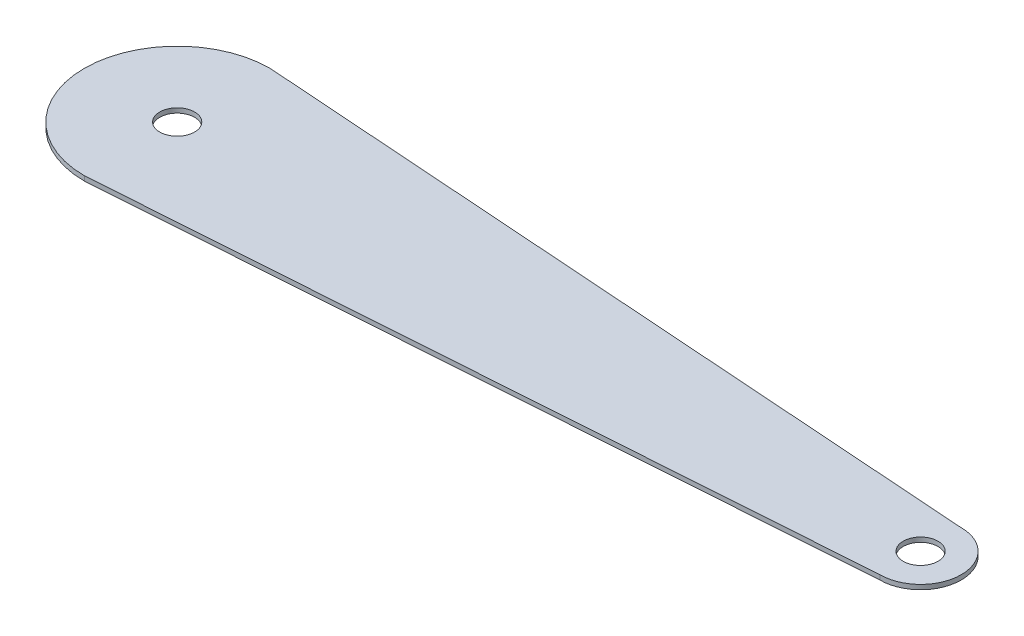
ISO-10303-21;
HEADER;
FILE_DESCRIPTION(('STEP AP214'),'2;1');
FILE_NAME('part.step','',(''),(''),'','','');
FILE_SCHEMA(('AUTOMOTIVE_DESIGN { 1 0 10303 214 1 1 1 1 }'));
ENDSEC;
DATA;
#1=APPLICATION_CONTEXT('core data for automotive mechanical design processes');
#2=APPLICATION_PROTOCOL_DEFINITION('international standard','automotive_design',2000,#1);
#3=PRODUCT_CONTEXT('',#1,'mechanical');
#4=PRODUCT('Part','Part','',(#3));
#5=PRODUCT_RELATED_PRODUCT_CATEGORY('part','',(#4));
#6=PRODUCT_DEFINITION_FORMATION('','',#4);
#7=PRODUCT_DEFINITION_CONTEXT('part definition',#1,'design');
#8=PRODUCT_DEFINITION('design','',#6,#7);
#9=PRODUCT_DEFINITION_SHAPE('','',#8);
#10=(LENGTH_UNIT() NAMED_UNIT(*) SI_UNIT(.MILLI.,.METRE.));
#11=(NAMED_UNIT(*) PLANE_ANGLE_UNIT() SI_UNIT($,.RADIAN.));
#12=(NAMED_UNIT(*) SI_UNIT($,.STERADIAN.) SOLID_ANGLE_UNIT());
#13=UNCERTAINTY_MEASURE_WITH_UNIT(LENGTH_MEASURE(1.E-05),#10,'distance_accuracy_value','');
#14=(GEOMETRIC_REPRESENTATION_CONTEXT(3) GLOBAL_UNCERTAINTY_ASSIGNED_CONTEXT((#13)) GLOBAL_UNIT_ASSIGNED_CONTEXT((#10,
#11,#12)) REPRESENTATION_CONTEXT('',''));
#15=CARTESIAN_POINT('',(0.,0.,0.));
#16=DIRECTION('',(0.,0.,1.));
#17=DIRECTION('',(1.,0.,0.));
#18=AXIS2_PLACEMENT_3D('',#15,#16,#17);
#19=CARTESIAN_POINT('',(2.55465532948679,2.54,36.3328757971454));
#20=DIRECTION('',(0.0701393346692204,0.,0.997537204184465));
#21=DIRECTION('',(0.997537204184465,0.,-0.0701393346692204));
#22=AXIS2_PLACEMENT_3D('',#19,#20,#21);
#23=PLANE('',#22);
#24=DIRECTION('',(-0.997537204184465,0.,0.0701393346692204));
#25=VECTOR('',#24,1.);
#26=CARTESIAN_POINT('',(2.55465532948679,0.,36.3328757971454));
#27=LINE('',#26,#25);
#28=CARTESIAN_POINT('',(203.2,0.,22.2249999999999));
#29=VERTEX_POINT('',#28);
#30=CARTESIAN_POINT('',(-203.2,0.,50.8));
#31=VERTEX_POINT('',#30);
#32=EDGE_CURVE('E107',#29,#31,#27,.T.);
#33=ORIENTED_EDGE('',*,*,#32,.F.);
#34=DIRECTION('',(0.,-1.,0.));
#35=VECTOR('',#34,1.);
#36=CARTESIAN_POINT('',(203.2,2.54,22.2249999999999));
#37=LINE('',#36,#35);
#38=CARTESIAN_POINT('',(203.2,2.54,22.2249999999999));
#39=VERTEX_POINT('',#38);
#40=EDGE_CURVE('E11',#39,#29,#37,.T.);
#41=ORIENTED_EDGE('',*,*,#40,.F.);
#42=DIRECTION('',(-0.997537204184465,0.,0.0701393346692204));
#43=VECTOR('',#42,1.);
#44=CARTESIAN_POINT('',(2.55465532948679,2.54,36.3328757971454));
#45=LINE('',#44,#43);
#46=CARTESIAN_POINT('',(-203.2,2.54,50.8));
#47=VERTEX_POINT('',#46);
#48=EDGE_CURVE('E91',#39,#47,#45,.T.);
#49=ORIENTED_EDGE('',*,*,#48,.T.);
#50=DIRECTION('',(0.,-1.,0.));
#51=VECTOR('',#50,1.);
#52=CARTESIAN_POINT('',(-203.2,2.54,50.8));
#53=LINE('',#52,#51);
#54=EDGE_CURVE('E81',#47,#31,#53,.T.);
#55=ORIENTED_EDGE('',*,*,#54,.T.);
#56=EDGE_LOOP('',(#33,#41,#49,#55));
#57=FACE_BOUND('',#56,.T.);
#58=ADVANCED_FACE('F41',(#57),#23,.T.);
#59=CARTESIAN_POINT('',(203.2,2.54,0.));
#60=DIRECTION('',(0.,-1.,0.));
#61=DIRECTION('',(0.,0.,-1.));
#62=AXIS2_PLACEMENT_3D('',#59,#60,#61);
#63=CYLINDRICAL_SURFACE('',#62,22.2249999999999);
#64=CARTESIAN_POINT('',(203.2,0.,0.));
#65=DIRECTION('',(0.,1.,0.));
#66=DIRECTION('',(0.,0.,1.));
#67=AXIS2_PLACEMENT_3D('',#64,#65,#66);
#68=CIRCLE('',#67,22.2249999999999);
#69=CARTESIAN_POINT('',(203.2,0.,-22.2249999999999));
#70=VERTEX_POINT('',#69);
#71=EDGE_CURVE('E97',#29,#70,#68,.T.);
#72=ORIENTED_EDGE('',*,*,#71,.T.);
#73=DIRECTION('',(0.,-1.,0.));
#74=VECTOR('',#73,1.);
#75=CARTESIAN_POINT('',(203.2,2.54,-22.2249999999999));
#76=LINE('',#75,#74);
#77=CARTESIAN_POINT('',(203.2,2.54,-22.2249999999999));
#78=VERTEX_POINT('',#77);
#79=EDGE_CURVE('E50',#78,#70,#76,.T.);
#80=ORIENTED_EDGE('',*,*,#79,.F.);
#81=CARTESIAN_POINT('',(203.2,2.54,0.));
#82=DIRECTION('',(0.,1.,0.));
#83=DIRECTION('',(0.,0.,1.));
#84=AXIS2_PLACEMENT_3D('',#81,#82,#83);
#85=CIRCLE('',#84,22.2249999999999);
#86=EDGE_CURVE('E86',#39,#78,#85,.T.);
#87=ORIENTED_EDGE('',*,*,#86,.F.);
#88=ORIENTED_EDGE('',*,*,#40,.T.);
#89=EDGE_LOOP('',(#72,#80,#87,#88));
#90=FACE_BOUND('',#89,.T.);
#91=ADVANCED_FACE('F95',(#90),#63,.T.);
#92=CARTESIAN_POINT('',(2.55465532948679,2.54,-36.3328757971454));
#93=DIRECTION('',(0.0701393346692204,0.,-0.997537204184465));
#94=DIRECTION('',(-0.997537204184465,0.,-0.0701393346692204));
#95=AXIS2_PLACEMENT_3D('',#92,#93,#94);
#96=PLANE('',#95);
#97=DIRECTION('',(0.997537204184465,0.,0.0701393346692204));
#98=VECTOR('',#97,1.);
#99=CARTESIAN_POINT('',(2.55465532948679,0.,-36.3328757971454));
#100=LINE('',#99,#98);
#101=CARTESIAN_POINT('',(-203.2,0.,-50.8));
#102=VERTEX_POINT('',#101);
#103=EDGE_CURVE('E111',#102,#70,#100,.T.);
#104=ORIENTED_EDGE('',*,*,#103,.F.);
#105=DIRECTION('',(0.,-1.,0.));
#106=VECTOR('',#105,1.);
#107=CARTESIAN_POINT('',(-203.2,2.54,-50.8));
#108=LINE('',#107,#106);
#109=CARTESIAN_POINT('',(-203.2,2.54,-50.8));
#110=VERTEX_POINT('',#109);
#111=EDGE_CURVE('E74',#110,#102,#108,.T.);
#112=ORIENTED_EDGE('',*,*,#111,.F.);
#113=DIRECTION('',(0.997537204184465,0.,0.0701393346692204));
#114=VECTOR('',#113,1.);
#115=CARTESIAN_POINT('',(2.55465532948679,2.54,-36.3328757971454));
#116=LINE('',#115,#114);
#117=EDGE_CURVE('E90',#110,#78,#116,.T.);
#118=ORIENTED_EDGE('',*,*,#117,.T.);
#119=ORIENTED_EDGE('',*,*,#79,.T.);
#120=EDGE_LOOP('',(#104,#112,#118,#119));
#121=FACE_BOUND('',#120,.T.);
#122=ADVANCED_FACE('F102',(#121),#96,.T.);
#123=CARTESIAN_POINT('',(-203.2,2.54,0.));
#124=DIRECTION('',(0.,-1.,0.));
#125=DIRECTION('',(0.,0.,-1.));
#126=AXIS2_PLACEMENT_3D('',#123,#124,#125);
#127=CYLINDRICAL_SURFACE('',#126,50.8);
#128=CARTESIAN_POINT('',(-203.2,0.,0.));
#129=DIRECTION('',(0.,1.,0.));
#130=DIRECTION('',(0.,0.,1.));
#131=AXIS2_PLACEMENT_3D('',#128,#129,#130);
#132=CIRCLE('',#131,50.8);
#133=EDGE_CURVE('E113',#102,#31,#132,.T.);
#134=ORIENTED_EDGE('',*,*,#133,.T.);
#135=ORIENTED_EDGE('',*,*,#54,.F.);
#136=CARTESIAN_POINT('',(-203.2,2.54,0.));
#137=DIRECTION('',(0.,1.,0.));
#138=DIRECTION('',(0.,0.,1.));
#139=AXIS2_PLACEMENT_3D('',#136,#137,#138);
#140=CIRCLE('',#139,50.8);
#141=EDGE_CURVE('E59',#110,#47,#140,.T.);
#142=ORIENTED_EDGE('',*,*,#141,.F.);
#143=ORIENTED_EDGE('',*,*,#111,.T.);
#144=EDGE_LOOP('',(#134,#135,#142,#143));
#145=FACE_BOUND('',#144,.T.);
#146=ADVANCED_FACE('F136',(#145),#127,.T.);
#147=CARTESIAN_POINT('',(0.,2.54,0.));
#148=DIRECTION('',(0.,1.,0.));
#149=DIRECTION('',(0.,0.,1.));
#150=AXIS2_PLACEMENT_3D('',#147,#148,#149);
#151=PLANE('',#150);
#152=CARTESIAN_POINT('',(-203.2,2.54,0.));
#153=DIRECTION('',(0.,1.,0.));
#154=DIRECTION('',(0.,0.,1.));
#155=AXIS2_PLACEMENT_3D('',#152,#153,#154);
#156=CIRCLE('',#155,9.525);
#157=CARTESIAN_POINT('',(-203.2,2.53999999999999,9.525));
#158=VERTEX_POINT('',#157);
#159=EDGE_CURVE('E118',#158,#158,#156,.T.);
#160=ORIENTED_EDGE('',*,*,#159,.F.);
#161=EDGE_LOOP('',(#160));
#162=FACE_BOUND('',#161,.T.);
#163=CARTESIAN_POINT('',(203.2,2.54,0.));
#164=DIRECTION('',(0.,1.,0.));
#165=DIRECTION('',(0.,0.,1.));
#166=AXIS2_PLACEMENT_3D('',#163,#164,#165);
#167=CIRCLE('',#166,9.525);
#168=CARTESIAN_POINT('',(203.2,2.53999999999999,9.52499999999992));
#169=VERTEX_POINT('',#168);
#170=EDGE_CURVE('E123',#169,#169,#167,.T.);
#171=ORIENTED_EDGE('',*,*,#170,.F.);
#172=EDGE_LOOP('',(#171));
#173=FACE_BOUND('',#172,.T.);
#174=ORIENTED_EDGE('',*,*,#48,.F.);
#175=ORIENTED_EDGE('',*,*,#86,.T.);
#176=ORIENTED_EDGE('',*,*,#117,.F.);
#177=ORIENTED_EDGE('',*,*,#141,.T.);
#178=EDGE_LOOP('',(#174,#175,#176,#177));
#179=FACE_BOUND('',#178,.T.);
#180=ADVANCED_FACE('F88',(#162,#173,#179),#151,.T.);
#181=CARTESIAN_POINT('',(0.,0.,0.));
#182=DIRECTION('',(0.,1.,0.));
#183=DIRECTION('',(0.,0.,1.));
#184=AXIS2_PLACEMENT_3D('',#181,#182,#183);
#185=PLANE('',#184);
#186=CARTESIAN_POINT('',(-203.2,0.,0.));
#187=DIRECTION('',(0.,1.,0.));
#188=DIRECTION('',(0.,0.,1.));
#189=AXIS2_PLACEMENT_3D('',#186,#187,#188);
#190=CIRCLE('',#189,9.525);
#191=CARTESIAN_POINT('',(-203.2,0.,9.525));
#192=VERTEX_POINT('',#191);
#193=EDGE_CURVE('E44',#192,#192,#190,.T.);
#194=ORIENTED_EDGE('',*,*,#193,.T.);
#195=EDGE_LOOP('',(#194));
#196=FACE_BOUND('',#195,.T.);
#197=CARTESIAN_POINT('',(203.2,0.,0.));
#198=DIRECTION('',(0.,1.,0.));
#199=DIRECTION('',(0.,0.,1.));
#200=AXIS2_PLACEMENT_3D('',#197,#198,#199);
#201=CIRCLE('',#200,9.525);
#202=CARTESIAN_POINT('',(203.2,0.,9.52499999999992));
#203=VERTEX_POINT('',#202);
#204=EDGE_CURVE('E116',#203,#203,#201,.T.);
#205=ORIENTED_EDGE('',*,*,#204,.T.);
#206=EDGE_LOOP('',(#205));
#207=FACE_BOUND('',#206,.T.);
#208=ORIENTED_EDGE('',*,*,#32,.T.);
#209=ORIENTED_EDGE('',*,*,#133,.F.);
#210=ORIENTED_EDGE('',*,*,#103,.T.);
#211=ORIENTED_EDGE('',*,*,#71,.F.);
#212=EDGE_LOOP('',(#208,#209,#210,#211));
#213=FACE_BOUND('',#212,.T.);
#214=ADVANCED_FACE('F141',(#196,#207,#213),#185,.F.);
#215=CARTESIAN_POINT('',(203.2,-173.228,0.));
#216=DIRECTION('',(0.,1.,0.));
#217=DIRECTION('',(0.,0.,1.));
#218=AXIS2_PLACEMENT_3D('',#215,#216,#217);
#219=CYLINDRICAL_SURFACE('',#218,9.525);
#220=CARTESIAN_POINT('',(203.2,2.53999999999999,9.52499999999992));
#221=CARTESIAN_POINT('',(203.2,2.51354166666666,9.52499999999992));
#222=CARTESIAN_POINT('',(203.2,2.48708333333333,9.52499999999992));
#223=CARTESIAN_POINT('',(203.2,2.43416666666666,9.52499999999992));
#224=CARTESIAN_POINT('',(203.2,2.40770833333333,9.52499999999992));
#225=CARTESIAN_POINT('',(203.2,2.35479166666666,9.52499999999992));
#226=CARTESIAN_POINT('',(203.2,2.32833333333332,9.52499999999992));
#227=CARTESIAN_POINT('',(203.2,2.27541666666665,9.52499999999992));
#228=CARTESIAN_POINT('',(203.2,2.24895833333332,9.52499999999992));
#229=CARTESIAN_POINT('',(203.2,2.19604166666666,9.52499999999992));
#230=CARTESIAN_POINT('',(203.2,2.16958333333333,9.52499999999992));
#231=CARTESIAN_POINT('',(203.2,2.11666666666666,9.52499999999992));
#232=CARTESIAN_POINT('',(203.2,2.09020833333332,9.52499999999992));
#233=CARTESIAN_POINT('',(203.2,2.03729166666664,9.52499999999992));
#234=CARTESIAN_POINT('',(203.2,2.01083333333331,9.52499999999992));
#235=CARTESIAN_POINT('',(203.2,1.95791666666665,9.52499999999992));
#236=CARTESIAN_POINT('',(203.2,1.93145833333332,9.52499999999992));
#237=CARTESIAN_POINT('',(203.2,1.87854166666666,9.52499999999992));
#238=CARTESIAN_POINT('',(203.2,1.85208333333333,9.52499999999992));
#239=CARTESIAN_POINT('',(203.2,1.79916666666667,9.52499999999992));
#240=CARTESIAN_POINT('',(203.2,1.77270833333334,9.52499999999992));
#241=CARTESIAN_POINT('',(203.2,1.71979166666666,9.52499999999992));
#242=CARTESIAN_POINT('',(203.2,1.69333333333332,9.52499999999992));
#243=CARTESIAN_POINT('',(203.2,1.64041666666665,9.52499999999992));
#244=CARTESIAN_POINT('',(203.2,1.61395833333332,9.52499999999992));
#245=CARTESIAN_POINT('',(203.2,1.56104166666666,9.52499999999992));
#246=CARTESIAN_POINT('',(203.2,1.53458333333333,9.52499999999992));
#247=CARTESIAN_POINT('',(203.2,1.48166666666666,9.52499999999992));
#248=CARTESIAN_POINT('',(203.2,1.45520833333332,9.52499999999992));
#249=CARTESIAN_POINT('',(203.2,1.40229166666665,9.52499999999992));
#250=CARTESIAN_POINT('',(203.2,1.37583333333332,9.52499999999992));
#251=CARTESIAN_POINT('',(203.2,1.32291666666666,9.52499999999992));
#252=CARTESIAN_POINT('',(203.2,1.29645833333332,9.52499999999992));
#253=CARTESIAN_POINT('',(203.2,1.24354166666666,9.52499999999992));
#254=CARTESIAN_POINT('',(203.2,1.21708333333333,9.52499999999992));
#255=CARTESIAN_POINT('',(203.2,1.16416666666667,9.52499999999992));
#256=CARTESIAN_POINT('',(203.2,1.13770833333334,9.52499999999992));
#257=CARTESIAN_POINT('',(203.2,1.08479166666667,9.52499999999992));
#258=CARTESIAN_POINT('',(203.2,1.05833333333333,9.52499999999992));
#259=CARTESIAN_POINT('',(203.2,1.00541666666666,9.52499999999992));
#260=CARTESIAN_POINT('',(203.2,0.978958333333326,9.52499999999992));
#261=CARTESIAN_POINT('',(203.2,0.926041666666664,9.52499999999992));
#262=CARTESIAN_POINT('',(203.2,0.899583333333333,9.52499999999992));
#263=CARTESIAN_POINT('',(203.2,0.846666666666662,9.52499999999992));
#264=CARTESIAN_POINT('',(203.2,0.820208333333322,9.52499999999992));
#265=CARTESIAN_POINT('',(203.2,0.767291666666651,9.52499999999992));
#266=CARTESIAN_POINT('',(203.2,0.74083333333332,9.52499999999992));
#267=CARTESIAN_POINT('',(203.2,0.687916666666658,9.52499999999992));
#268=CARTESIAN_POINT('',(203.2,0.661458333333328,9.52499999999992));
#269=CARTESIAN_POINT('',(203.2,0.608541666666666,9.52499999999992));
#270=CARTESIAN_POINT('',(203.2,0.582083333333335,9.52499999999992));
#271=CARTESIAN_POINT('',(203.2,0.529166666666673,9.52499999999992));
#272=CARTESIAN_POINT('',(203.2,0.502708333333342,9.52499999999992));
#273=CARTESIAN_POINT('',(203.2,0.449791666666671,9.52499999999992));
#274=CARTESIAN_POINT('',(203.2,0.423333333333331,9.52499999999992));
#275=CARTESIAN_POINT('',(203.2,0.37041666666666,9.52499999999992));
#276=CARTESIAN_POINT('',(203.2,0.343958333333329,9.52499999999992));
#277=CARTESIAN_POINT('',(203.2,0.291041666666667,9.52499999999992));
#278=CARTESIAN_POINT('',(203.2,0.264583333333337,9.52499999999992));
#279=CARTESIAN_POINT('',(203.2,0.211666666666666,9.52499999999992));
#280=CARTESIAN_POINT('',(203.2,0.185208333333325,9.52499999999992));
#281=CARTESIAN_POINT('',(203.2,0.132291666666654,9.52499999999992));
#282=CARTESIAN_POINT('',(203.2,0.105833333333324,9.52499999999992));
#283=CARTESIAN_POINT('',(203.2,0.0529166666666618,9.52499999999992));
#284=CARTESIAN_POINT('',(203.2,0.0264583333333309,9.52499999999992));
#285=CARTESIAN_POINT('',(203.2,0.,9.52499999999992));
#286=B_SPLINE_CURVE_WITH_KNOTS('',3,(#220,#221,#222,#223,#224,#225,#226,#227,#228,#229,#230,
#231,#232,#233,#234,#235,#236,#237,#238,#239,#240,#241,#242,#243,#244,#245,#246,#247,#248,#249,
#250,#251,#252,#253,#254,#255,#256,#257,#258,#259,#260,#261,#262,#263,#264,#265,#266,#267,#268,
#269,#270,#271,#272,#273,#274,#275,#276,#277,#278,#279,#280,#281,#282,#283,#284,#285),
.UNSPECIFIED.,.F.,.F.,(4,2,2,2,2,2,2,2,2,2,2,2,2,2,2,2,2,2,2,2,2,2,2,2,2,2,2,2,2,2,2,2,4),(0.,
0.0793749999999926,0.158749999999985,0.238125000000006,0.317499999999998,0.396874999999991,
0.476250000000011,0.555625000000004,0.634999999999997,0.714374999999989,0.793749999999982,
0.873125000000002,0.952499999999995,1.03187499999999,1.11125000000001,1.190625,1.26999999999999,
1.34937499999999,1.42874999999998,1.508125,1.58749999999999,1.66687499999998,1.74625,1.825625,
1.90499999999999,1.98437499999998,2.06374999999998,2.143125,2.22249999999999,2.30187499999998,
2.38125,2.46062499999999,2.53999999999999),.UNSPECIFIED.);
#287=EDGE_CURVE('BSEAM144',#169,#203,#286,.T.);
#288=ORIENTED_EDGE('',*,*,#170,.T.);
#289=ORIENTED_EDGE('',*,*,#204,.F.);
#290=ORIENTED_EDGE('',*,*,#287,.T.);
#291=ORIENTED_EDGE('',*,*,#287,.F.);
#292=EDGE_LOOP('',(#288,#290,#289,#291));
#293=FACE_BOUND('',#292,.T.);
#294=ADVANCED_FACE('F144',(#293),#219,.F.);
#295=CARTESIAN_POINT('',(-203.2,-173.228,0.));
#296=DIRECTION('',(0.,1.,0.));
#297=DIRECTION('',(0.,0.,1.));
#298=AXIS2_PLACEMENT_3D('',#295,#296,#297);
#299=CYLINDRICAL_SURFACE('',#298,9.525);
#300=CARTESIAN_POINT('',(-203.2,2.53999999999999,9.525));
#301=CARTESIAN_POINT('',(-203.2,2.51354166666666,9.525));
#302=CARTESIAN_POINT('',(-203.2,2.48708333333333,9.525));
#303=CARTESIAN_POINT('',(-203.2,2.43416666666666,9.525));
#304=CARTESIAN_POINT('',(-203.2,2.40770833333333,9.525));
#305=CARTESIAN_POINT('',(-203.2,2.35479166666666,9.525));
#306=CARTESIAN_POINT('',(-203.2,2.32833333333332,9.525));
#307=CARTESIAN_POINT('',(-203.2,2.27541666666665,9.525));
#308=CARTESIAN_POINT('',(-203.2,2.24895833333332,9.525));
#309=CARTESIAN_POINT('',(-203.2,2.19604166666666,9.525));
#310=CARTESIAN_POINT('',(-203.2,2.16958333333333,9.525));
#311=CARTESIAN_POINT('',(-203.2,2.11666666666666,9.525));
#312=CARTESIAN_POINT('',(-203.2,2.09020833333332,9.525));
#313=CARTESIAN_POINT('',(-203.2,2.03729166666664,9.525));
#314=CARTESIAN_POINT('',(-203.2,2.01083333333331,9.525));
#315=CARTESIAN_POINT('',(-203.2,1.95791666666665,9.525));
#316=CARTESIAN_POINT('',(-203.2,1.93145833333332,9.525));
#317=CARTESIAN_POINT('',(-203.2,1.87854166666666,9.525));
#318=CARTESIAN_POINT('',(-203.2,1.85208333333333,9.525));
#319=CARTESIAN_POINT('',(-203.2,1.79916666666667,9.525));
#320=CARTESIAN_POINT('',(-203.2,1.77270833333334,9.525));
#321=CARTESIAN_POINT('',(-203.2,1.71979166666666,9.525));
#322=CARTESIAN_POINT('',(-203.2,1.69333333333332,9.525));
#323=CARTESIAN_POINT('',(-203.2,1.64041666666665,9.525));
#324=CARTESIAN_POINT('',(-203.2,1.61395833333332,9.525));
#325=CARTESIAN_POINT('',(-203.2,1.56104166666666,9.525));
#326=CARTESIAN_POINT('',(-203.2,1.53458333333333,9.525));
#327=CARTESIAN_POINT('',(-203.2,1.48166666666666,9.525));
#328=CARTESIAN_POINT('',(-203.2,1.45520833333332,9.525));
#329=CARTESIAN_POINT('',(-203.2,1.40229166666665,9.525));
#330=CARTESIAN_POINT('',(-203.2,1.37583333333332,9.525));
#331=CARTESIAN_POINT('',(-203.2,1.32291666666666,9.525));
#332=CARTESIAN_POINT('',(-203.2,1.29645833333332,9.525));
#333=CARTESIAN_POINT('',(-203.2,1.24354166666666,9.525));
#334=CARTESIAN_POINT('',(-203.2,1.21708333333333,9.525));
#335=CARTESIAN_POINT('',(-203.2,1.16416666666667,9.525));
#336=CARTESIAN_POINT('',(-203.2,1.13770833333334,9.525));
#337=CARTESIAN_POINT('',(-203.2,1.08479166666667,9.525));
#338=CARTESIAN_POINT('',(-203.2,1.05833333333333,9.525));
#339=CARTESIAN_POINT('',(-203.2,1.00541666666666,9.525));
#340=CARTESIAN_POINT('',(-203.2,0.978958333333326,9.525));
#341=CARTESIAN_POINT('',(-203.2,0.926041666666664,9.525));
#342=CARTESIAN_POINT('',(-203.2,0.899583333333333,9.525));
#343=CARTESIAN_POINT('',(-203.2,0.846666666666662,9.525));
#344=CARTESIAN_POINT('',(-203.2,0.820208333333322,9.525));
#345=CARTESIAN_POINT('',(-203.2,0.767291666666651,9.525));
#346=CARTESIAN_POINT('',(-203.2,0.74083333333332,9.525));
#347=CARTESIAN_POINT('',(-203.2,0.687916666666658,9.525));
#348=CARTESIAN_POINT('',(-203.2,0.661458333333328,9.525));
#349=CARTESIAN_POINT('',(-203.2,0.608541666666666,9.525));
#350=CARTESIAN_POINT('',(-203.2,0.582083333333335,9.525));
#351=CARTESIAN_POINT('',(-203.2,0.529166666666673,9.525));
#352=CARTESIAN_POINT('',(-203.2,0.502708333333342,9.525));
#353=CARTESIAN_POINT('',(-203.2,0.449791666666671,9.525));
#354=CARTESIAN_POINT('',(-203.2,0.423333333333331,9.525));
#355=CARTESIAN_POINT('',(-203.2,0.37041666666666,9.525));
#356=CARTESIAN_POINT('',(-203.2,0.343958333333329,9.525));
#357=CARTESIAN_POINT('',(-203.2,0.291041666666667,9.525));
#358=CARTESIAN_POINT('',(-203.2,0.264583333333337,9.525));
#359=CARTESIAN_POINT('',(-203.2,0.211666666666666,9.525));
#360=CARTESIAN_POINT('',(-203.2,0.185208333333325,9.525));
#361=CARTESIAN_POINT('',(-203.2,0.132291666666654,9.525));
#362=CARTESIAN_POINT('',(-203.2,0.105833333333324,9.525));
#363=CARTESIAN_POINT('',(-203.2,0.0529166666666618,9.525));
#364=CARTESIAN_POINT('',(-203.2,0.0264583333333309,9.525));
#365=CARTESIAN_POINT('',(-203.2,0.,9.525));
#366=B_SPLINE_CURVE_WITH_KNOTS('',3,(#300,#301,#302,#303,#304,#305,#306,#307,#308,#309,#310,
#311,#312,#313,#314,#315,#316,#317,#318,#319,#320,#321,#322,#323,#324,#325,#326,#327,#328,#329,
#330,#331,#332,#333,#334,#335,#336,#337,#338,#339,#340,#341,#342,#343,#344,#345,#346,#347,#348,
#349,#350,#351,#352,#353,#354,#355,#356,#357,#358,#359,#360,#361,#362,#363,#364,#365),
.UNSPECIFIED.,.F.,.F.,(4,2,2,2,2,2,2,2,2,2,2,2,2,2,2,2,2,2,2,2,2,2,2,2,2,2,2,2,2,2,2,2,4),(0.,
0.0793749999999926,0.158749999999985,0.238125000000006,0.317499999999998,0.396874999999991,
0.476250000000011,0.555625000000004,0.634999999999997,0.714374999999989,0.793749999999982,
0.873125000000002,0.952499999999995,1.03187499999999,1.11125000000001,1.190625,1.26999999999999,
1.34937499999999,1.42874999999998,1.508125,1.58749999999999,1.66687499999998,1.74625,1.825625,
1.90499999999999,1.98437499999998,2.06374999999998,2.143125,2.22249999999999,2.30187499999998,
2.38125,2.46062499999999,2.53999999999999),.UNSPECIFIED.);
#367=EDGE_CURVE('BSEAM151',#158,#192,#366,.T.);
#368=ORIENTED_EDGE('',*,*,#159,.T.);
#369=ORIENTED_EDGE('',*,*,#193,.F.);
#370=ORIENTED_EDGE('',*,*,#367,.T.);
#371=ORIENTED_EDGE('',*,*,#367,.F.);
#372=EDGE_LOOP('',(#368,#370,#369,#371));
#373=FACE_BOUND('',#372,.T.);
#374=ADVANCED_FACE('F151',(#373),#299,.F.);
#375=CLOSED_SHELL('',(#58,#91,#122,#146,#180,#214,#294,#374));
#376=MANIFOLD_SOLID_BREP('B2',#375);
#377=ADVANCED_BREP_SHAPE_REPRESENTATION('',(#18,#376),#14);
#378=SHAPE_DEFINITION_REPRESENTATION(#9,#377);
ENDSEC;
END-ISO-10303-21;
